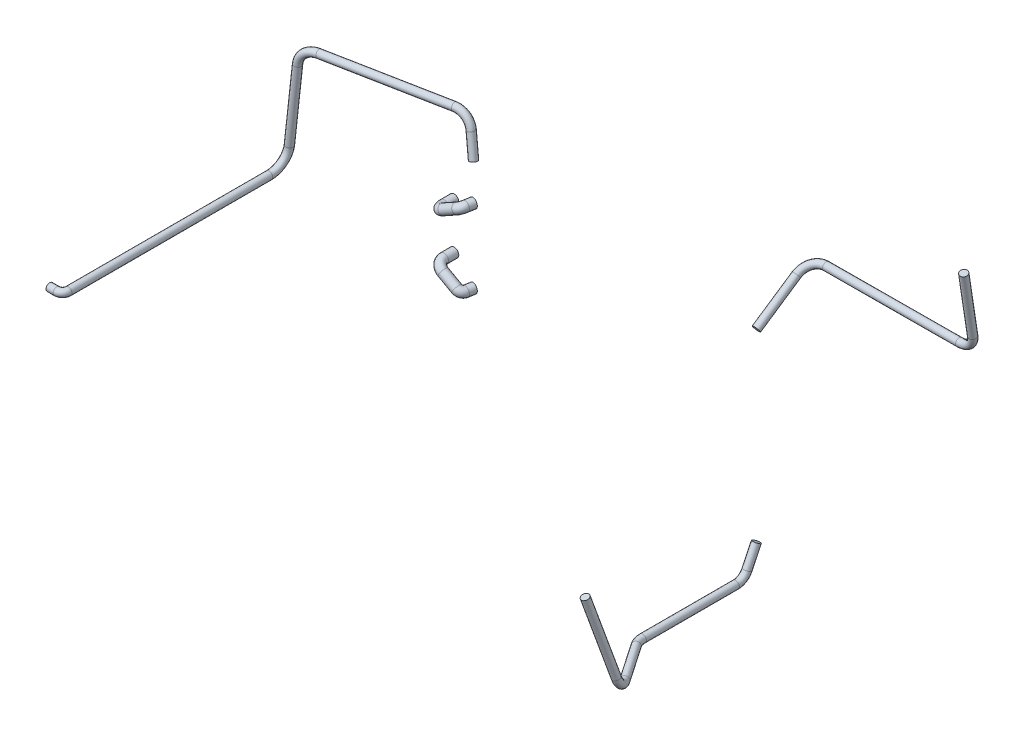
ISO-10303-21;
HEADER;
FILE_DESCRIPTION(('STEP AP214'),'2;1');
FILE_NAME('part.step','',(''),(''),'','','');
FILE_SCHEMA(('AUTOMOTIVE_DESIGN { 1 0 10303 214 1 1 1 1 }'));
ENDSEC;
DATA;
#1=APPLICATION_CONTEXT('core data for automotive mechanical design processes');
#2=APPLICATION_PROTOCOL_DEFINITION('international standard','automotive_design',2000,#1);
#3=PRODUCT_CONTEXT('',#1,'mechanical');
#4=PRODUCT('Part','Part','',(#3));
#5=PRODUCT_RELATED_PRODUCT_CATEGORY('part','',(#4));
#6=PRODUCT_DEFINITION_FORMATION('','',#4);
#7=PRODUCT_DEFINITION_CONTEXT('part definition',#1,'design');
#8=PRODUCT_DEFINITION('design','',#6,#7);
#9=PRODUCT_DEFINITION_SHAPE('','',#8);
#10=(LENGTH_UNIT() NAMED_UNIT(*) SI_UNIT(.MILLI.,.METRE.));
#11=(NAMED_UNIT(*) PLANE_ANGLE_UNIT() SI_UNIT($,.RADIAN.));
#12=(NAMED_UNIT(*) SI_UNIT($,.STERADIAN.) SOLID_ANGLE_UNIT());
#13=UNCERTAINTY_MEASURE_WITH_UNIT(LENGTH_MEASURE(1.E-05),#10,'distance_accuracy_value','');
#14=(GEOMETRIC_REPRESENTATION_CONTEXT(3) GLOBAL_UNCERTAINTY_ASSIGNED_CONTEXT((#13)) GLOBAL_UNIT_ASSIGNED_CONTEXT((#10,
#11,#12)) REPRESENTATION_CONTEXT('',''));
#15=CARTESIAN_POINT('',(0.,0.,0.));
#16=DIRECTION('',(0.,0.,1.));
#17=DIRECTION('',(1.,0.,0.));
#18=AXIS2_PLACEMENT_3D('',#15,#16,#17);
#19=CARTESIAN_POINT('',(846.,225.,330.));
#20=DIRECTION('',(0.0688927399967362,0.975980483287148,0.206678219990223));
#21=DIRECTION('',(-0.916848233170523,-0.0197221567225729,0.398748484468969));
#22=AXIS2_PLACEMENT_3D('',#19,#20,#21);
#23=PLANE('',#22);
#24=CARTESIAN_POINT('',(846.,225.,330.));
#25=DIRECTION('',(0.0688927399967362,0.975980483287148,0.206678219990223));
#26=DIRECTION('',(-0.916848233170523,-0.0197221567225729,0.398748484468969));
#27=AXIS2_PLACEMENT_3D('',#24,#25,#26);
#28=CIRCLE('',#27,4.);
#29=CARTESIAN_POINT('',(842.332607067318,224.92111137311,331.594993937876));
#30=VERTEX_POINT('',#29);
#31=EDGE_CURVE('E128',#30,#30,#28,.T.);
#32=ORIENTED_EDGE('',*,*,#31,.T.);
#33=EDGE_LOOP('',(#32));
#34=FACE_BOUND('',#33,.T.);
#35=ADVANCED_FACE('F107',(#34),#23,.T.);
#36=CARTESIAN_POINT('',(661.,100.,370.));
#37=DIRECTION('',(0.0143591631723555,0.574366526894194,-0.818472300824219));
#38=DIRECTION('',(0.,0.81855669246241,0.574425749096433));
#39=AXIS2_PLACEMENT_3D('',#36,#37,#38);
#40=PLANE('',#39);
#41=CARTESIAN_POINT('',(661.,100.,370.));
#42=DIRECTION('',(0.0143591631723555,0.574366526894194,-0.818472300824219));
#43=DIRECTION('',(0.,0.81855669246241,0.574425749096433));
#44=AXIS2_PLACEMENT_3D('',#41,#42,#43);
#45=CIRCLE('',#44,4.);
#46=CARTESIAN_POINT('',(661.,103.27422676985,372.297702996386));
#47=VERTEX_POINT('',#46);
#48=EDGE_CURVE('E12',#47,#47,#45,.T.);
#49=ORIENTED_EDGE('',*,*,#48,.F.);
#50=EDGE_LOOP('',(#49));
#51=FACE_BOUND('',#50,.T.);
#52=ADVANCED_FACE('F139',(#51),#40,.F.);
#53=CARTESIAN_POINT('',(846.,225.,330.));
#54=DIRECTION('',(-0.0688927399967393,-0.975980483287148,-0.20667821999022));
#55=DIRECTION('',(0.,0.207170441904584,-0.97830486454942));
#56=AXIS2_PLACEMENT_3D('',#53,#54,#55);
#57=CYLINDRICAL_SURFACE('',#56,4.);
#58=CARTESIAN_POINT('',(841.158739606136,156.415477753594,315.476218818408));
#59=DIRECTION('',(0.0688927399967362,0.975980483287148,0.206678219990223));
#60=DIRECTION('',(-0.916848233170523,-0.0197221567225729,0.398748484468969));
#61=AXIS2_PLACEMENT_3D('',#58,#59,#60);
#62=CIRCLE('',#61,4.);
#63=CARTESIAN_POINT('',(845.149175349941,156.150454357678,315.397572940079));
#64=VERTEX_POINT('',#63);
#65=EDGE_CURVE('E130',#64,#64,#62,.T.);
#66=ORIENTED_EDGE('',*,*,#65,.T.);
#67=EDGE_LOOP('',(#66));
#68=FACE_BOUND('',#67,.T.);
#69=ORIENTED_EDGE('',*,*,#31,.F.);
#70=EDGE_LOOP('',(#69));
#71=FACE_BOUND('',#70,.T.);
#72=ADVANCED_FACE('F134',(#68,#71),#57,.T.);
#73=CARTESIAN_POINT('',(823.201778759012,157.608083035219,315.830125270888));
#74=DIRECTION('',(-0.00549556965403732,0.207538571640638,-0.978211398418328));
#75=DIRECTION('',(0.,0.978226170373947,0.207541705677488));
#76=AXIS2_PLACEMENT_3D('',#73,#74,#75);
#77=TOROIDAL_SURFACE('',#76,18.,4.);
#78=CARTESIAN_POINT('',(823.180792043627,140.,312.094489932339));
#79=DIRECTION('',(0.999984219537789,0.,-0.00561788887380599));
#80=DIRECTION('',(0.00321244852110147,0.820375724292605,0.571815836756803));
#81=AXIS2_PLACEMENT_3D('',#78,#79,#80);
#82=CIRCLE('',#81,4.);
#83=CARTESIAN_POINT('',(823.176128329097,136.08709265884,311.264348745995));
#84=VERTEX_POINT('',#83);
#85=EDGE_CURVE('E122',#84,#84,#82,.T.);
#86=CARTESIAN_POINT('',(823.201778759012,157.608083035219,315.830125270888));
#87=DIRECTION('',(-0.00549556965403732,0.207538571640638,-0.978211398418328));
#88=DIRECTION('',(0.,0.978226170373947,0.207541705677488));
#89=AXIS2_PLACEMENT_3D('',#86,#87,#88);
#90=CIRCLE('',#89,22.);
#91=EDGE_CURVE('',#64,#84,#90,.T.);
#92=ORIENTED_EDGE('',*,*,#65,.F.);
#93=ORIENTED_EDGE('',*,*,#85,.T.);
#94=ORIENTED_EDGE('',*,*,#91,.T.);
#95=ORIENTED_EDGE('',*,*,#91,.F.);
#96=EDGE_LOOP('',(#92,#94,#93,#95));
#97=FACE_BOUND('',#96,.T.);
#98=ADVANCED_FACE('F137',(#97),#77,.T.);
#99=CARTESIAN_POINT('',(823.180792043627,140.,312.094489932339));
#100=DIRECTION('',(-0.999984219537789,0.,0.00561788887380822));
#101=DIRECTION('',(0.00561788887380822,0.,0.999984219537789));
#102=AXIS2_PLACEMENT_3D('',#99,#100,#101);
#103=CYLINDRICAL_SURFACE('',#102,4.);
#104=CARTESIAN_POINT('',(679.661668733026,140.,312.90077714195));
#105=DIRECTION('',(0.999984219537789,0.,-0.00561788887380499));
#106=DIRECTION('',(0.00321244852110208,0.820375724292605,0.571815836756803));
#107=AXIS2_PLACEMENT_3D('',#104,#105,#106);
#108=CIRCLE('',#107,4.);
#109=CARTESIAN_POINT('',(679.643275184946,142.297879037605,309.626725583723));
#110=VERTEX_POINT('',#109);
#111=EDGE_CURVE('E117',#110,#110,#108,.T.);
#112=ORIENTED_EDGE('',*,*,#111,.T.);
#113=EDGE_LOOP('',(#112));
#114=FACE_BOUND('',#113,.T.);
#115=ORIENTED_EDGE('',*,*,#85,.F.);
#116=EDGE_LOOP('',(#115));
#117=FACE_BOUND('',#116,.T.);
#118=ADVANCED_FACE('F144',(#114,#117),#103,.T.);
#119=CARTESIAN_POINT('',(679.744439699385,129.65954433078,327.63400915397));
#120=DIRECTION('',(0.00322730726967955,0.818525806272238,0.574460694002793));
#121=DIRECTION('',(0.,-0.57446368567735,0.818530068988303));
#122=AXIS2_PLACEMENT_3D('',#119,#120,#121);
#123=TOROIDAL_SURFACE('',#122,18.,4.);
#124=CARTESIAN_POINT('',(661.746389214672,129.855568586841,327.455814763752));
#125=DIRECTION('',(0.0143591631723555,0.574366526894194,-0.818472300824219));
#126=DIRECTION('',(0.,0.81855669246241,0.574425749096433));
#127=AXIS2_PLACEMENT_3D('',#124,#125,#126);
#128=CIRCLE('',#127,4.);
#129=CARTESIAN_POINT('',(657.74682244029,129.899129532632,327.41621601037));
#130=VERTEX_POINT('',#129);
#131=EDGE_CURVE('E111',#130,#130,#128,.T.);
#132=CARTESIAN_POINT('',(679.744439699385,129.65954433078,327.63400915397));
#133=DIRECTION('',(0.00322730726967955,0.818525806272238,0.574460694002793));
#134=DIRECTION('',(0.,-0.57446368567735,0.818530068988303));
#135=AXIS2_PLACEMENT_3D('',#132,#133,#134);
#136=CIRCLE('',#135,22.);
#137=EDGE_CURVE('',#110,#130,#136,.T.);
#138=ORIENTED_EDGE('',*,*,#111,.F.);
#139=ORIENTED_EDGE('',*,*,#131,.T.);
#140=ORIENTED_EDGE('',*,*,#137,.T.);
#141=ORIENTED_EDGE('',*,*,#137,.F.);
#142=EDGE_LOOP('',(#138,#140,#139,#141));
#143=FACE_BOUND('',#142,.T.);
#144=ADVANCED_FACE('F151',(#143),#123,.T.);
#145=CARTESIAN_POINT('',(661.746389214671,129.85556858684,327.455814763753));
#146=DIRECTION('',(-0.0143591631723542,-0.574366526894191,0.818472300824221));
#147=DIRECTION('',(0.,-0.818556692462413,-0.57442574909643));
#148=AXIS2_PLACEMENT_3D('',#145,#146,#147);
#149=CYLINDRICAL_SURFACE('',#148,4.);
#150=ORIENTED_EDGE('',*,*,#48,.T.);
#151=EDGE_LOOP('',(#150));
#152=FACE_BOUND('',#151,.T.);
#153=ORIENTED_EDGE('',*,*,#131,.F.);
#154=EDGE_LOOP('',(#153));
#155=FACE_BOUND('',#154,.T.);
#156=ADVANCED_FACE('F149',(#152,#155),#149,.T.);
#157=CLOSED_SHELL('',(#35,#52,#72,#98,#118,#144,#156));
#158=MANIFOLD_SOLID_BREP('B2',#157);
#159=CARTESIAN_POINT('',(690.,-29.9999999999998,584.864900164287));
#160=DIRECTION('',(-0.0972724077693302,0.953269596139435,0.286033487135536));
#161=DIRECTION('',(0.395013736834047,-0.226812428138079,0.890236075518461));
#162=AXIS2_PLACEMENT_3D('',#159,#160,#161);
#163=PLANE('',#162);
#164=CARTESIAN_POINT('',(690.,-29.9999999999998,584.864900164287));
#165=DIRECTION('',(-0.0972724077693302,0.953269596139435,0.286033487135536));
#166=DIRECTION('',(0.395013736834047,-0.226812428138079,0.890236075518461));
#167=AXIS2_PLACEMENT_3D('',#164,#165,#166);
#168=CIRCLE('',#167,4.00000000000001);
#169=CARTESIAN_POINT('',(691.580054947336,-30.9072497125521,588.425844466361));
#170=VERTEX_POINT('',#169);
#171=EDGE_CURVE('E244',#170,#170,#168,.T.);
#172=ORIENTED_EDGE('',*,*,#171,.T.);
#173=EDGE_LOOP('',(#172));
#174=FACE_BOUND('',#173,.T.);
#175=ADVANCED_FACE('F220',(#174),#163,.T.);
#176=CARTESIAN_POINT('',(661.,-100.,370.));
#177=DIRECTION('',(0.0314658387763716,-0.881043485738572,0.471987581645668));
#178=DIRECTION('',(0.,-0.472221412515422,-0.88147997002878));
#179=AXIS2_PLACEMENT_3D('',#176,#177,#178);
#180=PLANE('',#179);
#181=CARTESIAN_POINT('',(661.,-100.,370.));
#182=DIRECTION('',(0.0314658387763716,-0.881043485738572,0.471987581645668));
#183=DIRECTION('',(0.,-0.472221412515422,-0.88147997002878));
#184=AXIS2_PLACEMENT_3D('',#181,#182,#183);
#185=CIRCLE('',#184,4.00000000000001);
#186=CARTESIAN_POINT('',(661.,-101.888885650062,366.474080119885));
#187=VERTEX_POINT('',#186);
#188=EDGE_CURVE('E110',#187,#187,#185,.T.);
#189=ORIENTED_EDGE('',*,*,#188,.F.);
#190=EDGE_LOOP('',(#189));
#191=FACE_BOUND('',#190,.T.);
#192=ADVANCED_FACE('F251',(#191),#180,.F.);
#193=CARTESIAN_POINT('',(690.,-29.9999999999998,584.864900164287));
#194=DIRECTION('',(0.0972724077693298,-0.953269596139435,-0.286033487135537));
#195=DIRECTION('',(0.,0.287396379658363,-0.957811735655429));
#196=AXIS2_PLACEMENT_3D('',#193,#194,#195);
#197=CYLINDRICAL_SURFACE('',#196,4.00000000000001);
#198=CARTESIAN_POINT('',(698.541892534363,-113.71054683676,559.747116361352));
#199=DIRECTION('',(-0.0972724077693302,0.953269596139435,0.286033487135536));
#200=DIRECTION('',(0.395013736834047,-0.226812428138079,0.890236075518461));
#201=AXIS2_PLACEMENT_3D('',#198,#199,#200);
#202=CIRCLE('',#201,4.00000000000001);
#203=CARTESIAN_POINT('',(700.912376635838,-114.412212403913,562.891710223289));
#204=VERTEX_POINT('',#203);
#205=EDGE_CURVE('E245',#204,#204,#202,.T.);
#206=ORIENTED_EDGE('',*,*,#205,.T.);
#207=EDGE_LOOP('',(#206));
#208=FACE_BOUND('',#207,.T.);
#209=ORIENTED_EDGE('',*,*,#171,.F.);
#210=EDGE_LOOP('',(#209));
#211=FACE_BOUND('',#210,.T.);
#212=ADVANCED_FACE('F250',(#208,#211),#197,.T.);
#213=CARTESIAN_POINT('',(687.874714077729,-110.553051784569,545.596443982638));
#214=DIRECTION('',(0.799586392441657,0.245980012537813,-0.54786443072537));
#215=DIRECTION('',(-0.565231215871582,0.,-0.824932526091882));
#216=AXIS2_PLACEMENT_3D('',#213,#214,#215);
#217=TOROIDAL_SURFACE('',#216,17.9999999999999,4.00000000000001);
#218=CARTESIAN_POINT('',(691.527218513726,-128.,543.093803514435));
#219=DIRECTION('',(0.565231215871581,0.,0.824932526091882));
#220=DIRECTION('',(0.0155441165112846,-0.99982245690374,-0.0106505921362335));
#221=AXIS2_PLACEMENT_3D('',#218,#219,#220);
#222=CIRCLE('',#221,4.00000000000001);
#223=CARTESIAN_POINT('',(692.33888616617,-131.877099603429,542.537661188167));
#224=VERTEX_POINT('',#223);
#225=EDGE_CURVE('E239',#224,#224,#222,.T.);
#226=CARTESIAN_POINT('',(687.874714077729,-110.553051784569,545.596443982638));
#227=DIRECTION('',(0.799586392441657,0.245980012537813,-0.54786443072537));
#228=DIRECTION('',(-0.565231215871582,0.,-0.824932526091882));
#229=AXIS2_PLACEMENT_3D('',#226,#227,#228);
#230=CIRCLE('',#229,21.9999999999999);
#231=EDGE_CURVE('',#204,#224,#230,.T.);
#232=ORIENTED_EDGE('',*,*,#205,.F.);
#233=ORIENTED_EDGE('',*,*,#225,.T.);
#234=ORIENTED_EDGE('',*,*,#231,.T.);
#235=ORIENTED_EDGE('',*,*,#231,.F.);
#236=EDGE_LOOP('',(#232,#234,#233,#235));
#237=FACE_BOUND('',#236,.T.);
#238=ADVANCED_FACE('F252',(#237),#217,.T.);
#239=CARTESIAN_POINT('',(691.527218513726,-128.,543.093803514435));
#240=DIRECTION('',(-0.565231215871581,0.,-0.824932526091882));
#241=DIRECTION('',(-0.824932526091882,0.,0.565231215871581));
#242=AXIS2_PLACEMENT_3D('',#239,#240,#241);
#243=CYLINDRICAL_SURFACE('',#242,4.00000000000001);
#244=CARTESIAN_POINT('',(665.151214530346,-128.,504.599072538426));
#245=DIRECTION('',(0.565231215871582,0.,0.824932526091882));
#246=DIRECTION('',(0.0155441165112823,-0.99982245690374,-0.0106505921362371));
#247=AXIS2_PLACEMENT_3D('',#244,#245,#246);
#248=CIRCLE('',#247,4.00000000000001);
#249=CARTESIAN_POINT('',(661.851484425979,-128.,506.859997401912));
#250=VERTEX_POINT('',#249);
#251=EDGE_CURVE('E237',#250,#250,#248,.T.);
#252=ORIENTED_EDGE('',*,*,#251,.T.);
#253=EDGE_LOOP('',(#252));
#254=FACE_BOUND('',#253,.T.);
#255=ORIENTED_EDGE('',*,*,#225,.F.);
#256=EDGE_LOOP('',(#255));
#257=FACE_BOUND('',#256,.T.);
#258=ADVANCED_FACE('F257',(#254,#257),#243,.T.);
#259=CARTESIAN_POINT('',(680.,-128.,494.424910652737));
#260=DIRECTION('',(0.,-1.,0.));
#261=DIRECTION('',(0.,0.,-1.));
#262=AXIS2_PLACEMENT_3D('',#259,#260,#261);
#263=TOROIDAL_SURFACE('',#262,17.9999999999998,4.00000000000001);
#264=CARTESIAN_POINT('',(662.,-128.,494.424910652737));
#265=DIRECTION('',(0.,0.,1.));
#266=DIRECTION('',(0.0188428944424364,-0.99982245690374,0.));
#267=AXIS2_PLACEMENT_3D('',#264,#265,#266);
#268=CIRCLE('',#267,4.00000000000001);
#269=CARTESIAN_POINT('',(658.,-128.,494.424910652737));
#270=VERTEX_POINT('',#269);
#271=EDGE_CURVE('E231',#270,#270,#268,.T.);
#272=CARTESIAN_POINT('',(680.,-128.,494.424910652737));
#273=DIRECTION('',(0.,-1.,0.));
#274=DIRECTION('',(0.,0.,-1.));
#275=AXIS2_PLACEMENT_3D('',#272,#273,#274);
#276=CIRCLE('',#275,21.9999999999998);
#277=EDGE_CURVE('',#250,#270,#276,.T.);
#278=ORIENTED_EDGE('',*,*,#251,.F.);
#279=ORIENTED_EDGE('',*,*,#271,.T.);
#280=ORIENTED_EDGE('',*,*,#277,.T.);
#281=ORIENTED_EDGE('',*,*,#277,.F.);
#282=EDGE_LOOP('',(#278,#280,#279,#281));
#283=FACE_BOUND('',#282,.T.);
#284=ADVANCED_FACE('F280',(#283),#263,.T.);
#285=CARTESIAN_POINT('',(662.,-128.,494.424910652737));
#286=DIRECTION('',(0.,0.,-1.));
#287=DIRECTION('',(-1.,0.,0.));
#288=AXIS2_PLACEMENT_3D('',#285,#286,#287);
#289=CYLINDRICAL_SURFACE('',#288,4.00000000000001);
#290=CARTESIAN_POINT('',(662.,-128.,393.565312174315));
#291=DIRECTION('',(0.,0.,1.));
#292=DIRECTION('',(0.0188428944424364,-0.99982245690374,0.));
#293=AXIS2_PLACEMENT_3D('',#290,#291,#292);
#294=CIRCLE('',#293,4.00000000000001);
#295=CARTESIAN_POINT('',(662.14276612205,-131.99745141739,393.565312174315));
#296=VERTEX_POINT('',#295);
#297=EDGE_CURVE('E230',#296,#296,#294,.T.);
#298=ORIENTED_EDGE('',*,*,#297,.T.);
#299=EDGE_LOOP('',(#298));
#300=FACE_BOUND('',#299,.T.);
#301=ORIENTED_EDGE('',*,*,#271,.F.);
#302=EDGE_LOOP('',(#301));
#303=FACE_BOUND('',#302,.T.);
#304=ADVANCED_FACE('F271',(#300,#303),#289,.T.);
#305=CARTESIAN_POINT('',(661.489567437095,-113.707888238657,393.565312174315));
#306=DIRECTION('',(0.99936285434755,0.0356915305124057,0.));
#307=DIRECTION('',(-0.0356915305124057,0.99936285434755,0.));
#308=AXIS2_PLACEMENT_3D('',#305,#306,#307);
#309=TOROIDAL_SURFACE('',#308,14.3012237238635,4.00000000000001);
#310=CARTESIAN_POINT('',(661.730485268054,-120.453587505501,380.957279020806));
#311=DIRECTION('',(0.0314658387763716,-0.881043485738572,0.471987581645668));
#312=DIRECTION('',(0.,-0.472221412515422,-0.88147997002878));
#313=AXIS2_PLACEMENT_3D('',#310,#311,#312);
#314=CIRCLE('',#313,4.00000000000001);
#315=CARTESIAN_POINT('',(661.797869104741,-122.340334932741,377.430858234177));
#316=VERTEX_POINT('',#315);
#317=EDGE_CURVE('E224',#316,#316,#314,.T.);
#318=CARTESIAN_POINT('',(661.489567437095,-113.707888238657,393.565312174315));
#319=DIRECTION('',(0.99936285434755,0.0356915305124057,0.));
#320=DIRECTION('',(-0.0356915305124057,0.99936285434755,0.));
#321=AXIS2_PLACEMENT_3D('',#318,#319,#320);
#322=CIRCLE('',#321,18.3012237238635);
#323=EDGE_CURVE('',#296,#316,#322,.T.);
#324=ORIENTED_EDGE('',*,*,#297,.F.);
#325=ORIENTED_EDGE('',*,*,#317,.T.);
#326=ORIENTED_EDGE('',*,*,#323,.T.);
#327=ORIENTED_EDGE('',*,*,#323,.F.);
#328=EDGE_LOOP('',(#324,#326,#325,#327));
#329=FACE_BOUND('',#328,.T.);
#330=ADVANCED_FACE('F266',(#329),#309,.T.);
#331=CARTESIAN_POINT('',(661.730485268054,-120.453587505503,380.957279020805));
#332=DIRECTION('',(-0.0314658387763716,0.881043485738573,-0.471987581645667));
#333=DIRECTION('',(0.,0.472221412515421,0.881479970028781));
#334=AXIS2_PLACEMENT_3D('',#331,#332,#333);
#335=CYLINDRICAL_SURFACE('',#334,4.00000000000001);
#336=ORIENTED_EDGE('',*,*,#188,.T.);
#337=EDGE_LOOP('',(#336));
#338=FACE_BOUND('',#337,.T.);
#339=ORIENTED_EDGE('',*,*,#317,.F.);
#340=EDGE_LOOP('',(#339));
#341=FACE_BOUND('',#340,.T.);
#342=ADVANCED_FACE('F262',(#338,#341),#335,.T.);
#343=CLOSED_SHELL('',(#175,#192,#212,#238,#258,#284,#304,#330,#342));
#344=MANIFOLD_SOLID_BREP('B7',#343);
#345=CARTESIAN_POINT('',(138.,0.,614.));
#346=DIRECTION('',(-1.,0.,0.));
#347=DIRECTION('',(0.,-0.326144478322474,0.945319934868488));
#348=AXIS2_PLACEMENT_3D('',#345,#346,#347);
#349=PLANE('',#348);
#350=CARTESIAN_POINT('',(138.,0.,614.));
#351=DIRECTION('',(-1.,0.,0.));
#352=DIRECTION('',(0.,-0.326144478322474,0.945319934868488));
#353=AXIS2_PLACEMENT_3D('',#350,#351,#352);
#354=CIRCLE('',#353,4.00000000000002);
#355=CARTESIAN_POINT('',(138.,-1.3045779132899,617.781279739474));
#356=VERTEX_POINT('',#355);
#357=EDGE_CURVE('E388',#356,#356,#354,.T.);
#358=ORIENTED_EDGE('',*,*,#357,.T.);
#359=EDGE_LOOP('',(#358));
#360=FACE_BOUND('',#359,.T.);
#361=ADVANCED_FACE('F356',(#360),#349,.T.);
#362=CARTESIAN_POINT('',(329.,80.,345.));
#363=DIRECTION('',(-0.22860022860034,0.965200965201449,-0.127000127000185));
#364=DIRECTION('',(-0.97308028749001,-0.23046638387921,0.));
#365=AXIS2_PLACEMENT_3D('',#362,#363,#364);
#366=PLANE('',#365);
#367=CARTESIAN_POINT('',(329.,80.,345.));
#368=DIRECTION('',(-0.22860022860034,0.965200965201449,-0.127000127000185));
#369=DIRECTION('',(-0.97308028749001,-0.23046638387921,0.));
#370=AXIS2_PLACEMENT_3D('',#367,#368,#369);
#371=CIRCLE('',#370,4.00000000000002);
#372=CARTESIAN_POINT('',(325.10767885004,79.0781344644832,345.));
#373=VERTEX_POINT('',#372);
#374=EDGE_CURVE('E216',#373,#373,#371,.T.);
#375=ORIENTED_EDGE('',*,*,#374,.F.);
#376=EDGE_LOOP('',(#375));
#377=FACE_BOUND('',#376,.T.);
#378=ADVANCED_FACE('F399',(#377),#366,.F.);
#379=CARTESIAN_POINT('',(138.,0.,614.));
#380=DIRECTION('',(1.,0.,0.));
#381=DIRECTION('',(0.,0.,-1.));
#382=AXIS2_PLACEMENT_3D('',#379,#380,#381);
#383=CYLINDRICAL_SURFACE('',#382,4.00000000000002);
#384=CARTESIAN_POINT('',(145.7,0.,614.));
#385=DIRECTION('',(-1.,0.,0.));
#386=DIRECTION('',(0.,-0.326144478322474,0.945319934868488));
#387=AXIS2_PLACEMENT_3D('',#384,#385,#386);
#388=CIRCLE('',#387,4.00000000000002);
#389=CARTESIAN_POINT('',(145.7,0.,618.));
#390=VERTEX_POINT('',#389);
#391=EDGE_CURVE('E390',#390,#390,#388,.T.);
#392=ORIENTED_EDGE('',*,*,#391,.T.);
#393=EDGE_LOOP('',(#392));
#394=FACE_BOUND('',#393,.T.);
#395=ORIENTED_EDGE('',*,*,#357,.F.);
#396=EDGE_LOOP('',(#395));
#397=FACE_BOUND('',#396,.T.);
#398=ADVANCED_FACE('F394',(#394,#397),#383,.T.);
#399=CARTESIAN_POINT('',(145.7,0.,607.7));
#400=DIRECTION('',(0.,1.,0.));
#401=DIRECTION('',(0.,0.,1.));
#402=AXIS2_PLACEMENT_3D('',#399,#400,#401);
#403=TOROIDAL_SURFACE('',#402,6.29999999999986,4.00000000000002);
#404=CARTESIAN_POINT('',(152.,0.,607.7));
#405=DIRECTION('',(0.,0.,1.));
#406=DIRECTION('',(0.945319934868488,-0.326144478322474,0.));
#407=AXIS2_PLACEMENT_3D('',#404,#405,#406);
#408=CIRCLE('',#407,4.00000000000002);
#409=CARTESIAN_POINT('',(156.,0.,607.7));
#410=VERTEX_POINT('',#409);
#411=EDGE_CURVE('E383',#410,#410,#408,.T.);
#412=CARTESIAN_POINT('',(145.7,0.,607.7));
#413=DIRECTION('',(0.,1.,0.));
#414=DIRECTION('',(0.,0.,1.));
#415=AXIS2_PLACEMENT_3D('',#412,#413,#414);
#416=CIRCLE('',#415,10.2999999999999);
#417=EDGE_CURVE('',#390,#410,#416,.T.);
#418=ORIENTED_EDGE('',*,*,#391,.F.);
#419=ORIENTED_EDGE('',*,*,#411,.T.);
#420=ORIENTED_EDGE('',*,*,#417,.T.);
#421=ORIENTED_EDGE('',*,*,#417,.F.);
#422=EDGE_LOOP('',(#418,#420,#419,#421));
#423=FACE_BOUND('',#422,.T.);
#424=ADVANCED_FACE('F397',(#423),#403,.T.);
#425=CARTESIAN_POINT('',(152.,0.,607.7));
#426=DIRECTION('',(0.,0.,-1.));
#427=DIRECTION('',(-1.,0.,0.));
#428=AXIS2_PLACEMENT_3D('',#425,#426,#427);
#429=CYLINDRICAL_SURFACE('',#428,4.00000000000002);
#430=CARTESIAN_POINT('',(152.,0.,390.));
#431=DIRECTION('',(0.,0.,1.));
#432=DIRECTION('',(0.945319934868488,-0.326144478322474,0.));
#433=AXIS2_PLACEMENT_3D('',#430,#431,#432);
#434=CIRCLE('',#433,4.00000000000002);
#435=CARTESIAN_POINT('',(151.561972257256,-3.97594412644186,390.));
#436=VERTEX_POINT('',#435);
#437=EDGE_CURVE('E381',#436,#436,#434,.T.);
#438=ORIENTED_EDGE('',*,*,#437,.T.);
#439=EDGE_LOOP('',(#438));
#440=FACE_BOUND('',#439,.T.);
#441=ORIENTED_EDGE('',*,*,#411,.F.);
#442=EDGE_LOOP('',(#441));
#443=FACE_BOUND('',#442,.T.);
#444=ADVANCED_FACE('F403',(#440,#443),#429,.T.);
#445=CARTESIAN_POINT('',(154.190138713718,19.879720632209,390.));
#446=DIRECTION('',(0.993986031610447,-0.109506935685896,0.));
#447=DIRECTION('',(0.109506935685896,0.993986031610447,0.));
#448=AXIS2_PLACEMENT_3D('',#445,#446,#447);
#449=TOROIDAL_SURFACE('',#448,20.0000000000001,4.00000000000002);
#450=CARTESIAN_POINT('',(154.190138713718,19.8797206322089,370.));
#451=DIRECTION('',(-0.109506935685898,-0.993986031610447,0.));
#452=DIRECTION('',(0.969484169648442,-0.106807578012118,-0.220663966429177));
#453=AXIS2_PLACEMENT_3D('',#450,#451,#452);
#454=CIRCLE('',#453,4.00000000000002);
#455=CARTESIAN_POINT('',(154.190138713718,19.8797206322089,366.));
#456=VERTEX_POINT('',#455);
#457=EDGE_CURVE('E378',#456,#456,#454,.T.);
#458=CARTESIAN_POINT('',(154.190138713718,19.879720632209,390.));
#459=DIRECTION('',(0.993986031610447,-0.109506935685896,0.));
#460=DIRECTION('',(0.109506935685896,0.993986031610447,0.));
#461=AXIS2_PLACEMENT_3D('',#458,#459,#460);
#462=CIRCLE('',#461,24.0000000000001);
#463=EDGE_CURVE('',#436,#456,#462,.T.);
#464=ORIENTED_EDGE('',*,*,#437,.F.);
#465=ORIENTED_EDGE('',*,*,#457,.T.);
#466=ORIENTED_EDGE('',*,*,#463,.T.);
#467=ORIENTED_EDGE('',*,*,#463,.F.);
#468=EDGE_LOOP('',(#464,#466,#465,#467));
#469=FACE_BOUND('',#468,.T.);
#470=ADVANCED_FACE('F429',(#469),#449,.T.);
#471=CARTESIAN_POINT('',(154.190138713718,19.8797206322089,370.));
#472=DIRECTION('',(0.109506935685896,0.993986031610447,0.));
#473=DIRECTION('',(-0.993986031610447,0.109506935685896,0.));
#474=AXIS2_PLACEMENT_3D('',#471,#472,#473);
#475=CYLINDRICAL_SURFACE('',#474,4.00000000000002);
#476=CARTESIAN_POINT('',(163.033931138136,100.154144176924,370.));
#477=DIRECTION('',(-0.109506935685898,-0.993986031610447,0.));
#478=DIRECTION('',(0.969484169648442,-0.106807578012118,-0.220663966429177));
#479=AXIS2_PLACEMENT_3D('',#476,#477,#478);
#480=CIRCLE('',#479,4.00000000000002);
#481=CARTESIAN_POINT('',(159.131284397477,100.584096783945,370.764518916275));
#482=VERTEX_POINT('',#481);
#483=EDGE_CURVE('E374',#482,#482,#480,.T.);
#484=ORIENTED_EDGE('',*,*,#483,.T.);
#485=EDGE_LOOP('',(#484));
#486=FACE_BOUND('',#485,.T.);
#487=ORIENTED_EDGE('',*,*,#457,.F.);
#488=EDGE_LOOP('',(#487));
#489=FACE_BOUND('',#488,.T.);
#490=ADVANCED_FACE('F426',(#486,#489),#475,.T.);
#491=CARTESIAN_POINT('',(182.547164841429,98.0043811418153,366.177405418625));
#492=DIRECTION('',(-0.189980280919827,0.0209300309487931,-0.981564784752441));
#493=DIRECTION('',(-0.981779850590281,0.,0.19002190656586));
#494=AXIS2_PLACEMENT_3D('',#491,#492,#493);
#495=TOROIDAL_SURFACE('',#494,20.0000000000002,4.00000000000002);
#496=CARTESIAN_POINT('',(182.626708129136,118.,366.58837907178));
#497=DIRECTION('',(-0.981779850590282,0.,0.190021906565861));
#498=DIRECTION('',(-0.009708505319868,-0.998693976174228,-0.050160610819302));
#499=AXIS2_PLACEMENT_3D('',#496,#497,#498);
#500=CIRCLE('',#499,4.00000000000002);
#501=CARTESIAN_POINT('',(182.642616786677,121.999123771637,366.670573802411));
#502=VERTEX_POINT('',#501);
#503=EDGE_CURVE('E367',#502,#502,#500,.T.);
#504=CARTESIAN_POINT('',(182.547164841429,98.0043811418153,366.177405418625));
#505=DIRECTION('',(-0.189980280919827,0.0209300309487931,-0.981564784752441));
#506=DIRECTION('',(-0.981779850590281,0.,0.19002190656586));
#507=AXIS2_PLACEMENT_3D('',#504,#505,#506);
#508=CIRCLE('',#507,24.0000000000002);
#509=EDGE_CURVE('',#482,#502,#508,.T.);
#510=ORIENTED_EDGE('',*,*,#483,.F.);
#511=ORIENTED_EDGE('',*,*,#503,.T.);
#512=ORIENTED_EDGE('',*,*,#509,.T.);
#513=ORIENTED_EDGE('',*,*,#509,.F.);
#514=EDGE_LOOP('',(#510,#512,#511,#513));
#515=FACE_BOUND('',#514,.T.);
#516=ADVANCED_FACE('F425',(#515),#495,.T.);
#517=CARTESIAN_POINT('',(182.626708129136,118.,366.58837907178));
#518=DIRECTION('',(0.981779850590281,0.,-0.190021906565861));
#519=DIRECTION('',(-0.190021906565861,0.,-0.981779850590282));
#520=AXIS2_PLACEMENT_3D('',#517,#518,#519);
#521=CYLINDRICAL_SURFACE('',#520,4.00000000000002);
#522=CARTESIAN_POINT('',(305.802558577869,118.,342.747891888154));
#523=DIRECTION('',(-0.981779850590281,0.,0.190021906565861));
#524=DIRECTION('',(-0.00970850531986742,-0.998693976174228,-0.0501606108193021));
#525=AXIS2_PLACEMENT_3D('',#522,#523,#524);
#526=CIRCLE('',#525,4.00000000000002);
#527=CARTESIAN_POINT('',(305.672125339471,121.940664808584,342.073986823096));
#528=VERTEX_POINT('',#527);
#529=EDGE_CURVE('E368',#528,#528,#526,.T.);
#530=ORIENTED_EDGE('',*,*,#529,.T.);
#531=EDGE_LOOP('',(#530));
#532=FACE_BOUND('',#531,.T.);
#533=ORIENTED_EDGE('',*,*,#503,.F.);
#534=EDGE_LOOP('',(#533));
#535=FACE_BOUND('',#534,.T.);
#536=ADVANCED_FACE('F418',(#532,#535),#521,.T.);
#537=CARTESIAN_POINT('',(306.380264272596,100.546285525959,345.732704644247));
#538=DIRECTION('',(-0.187203160016011,-0.171602896681339,-0.967216326749395));
#539=DIRECTION('',(-0.981779850590282,0.,0.19002190656586));
#540=AXIS2_PLACEMENT_3D('',#537,#538,#539);
#541=TOROIDAL_SURFACE('',#540,17.7165177165267,4.00000000000002);
#542=CARTESIAN_POINT('',(323.305769977544,104.042304539258,341.836538876413));
#543=DIRECTION('',(-0.22860022860034,0.965200965201449,-0.127000127000185));
#544=DIRECTION('',(-0.97308028749001,-0.23046638387921,0.));
#545=AXIS2_PLACEMENT_3D('',#542,#543,#544);
#546=CIRCLE('',#545,4.00000000000002);
#547=CARTESIAN_POINT('',(327.127176864781,104.831628732474,340.956870347829));
#548=VERTEX_POINT('',#547);
#549=EDGE_CURVE('E362',#548,#548,#546,.T.);
#550=CARTESIAN_POINT('',(306.380264272596,100.546285525959,345.732704644247));
#551=DIRECTION('',(-0.187203160016011,-0.171602896681339,-0.967216326749395));
#552=DIRECTION('',(-0.981779850590282,0.,0.19002190656586));
#553=AXIS2_PLACEMENT_3D('',#550,#551,#552);
#554=CIRCLE('',#553,21.7165177165267);
#555=EDGE_CURVE('',#528,#548,#554,.T.);
#556=ORIENTED_EDGE('',*,*,#529,.F.);
#557=ORIENTED_EDGE('',*,*,#549,.T.);
#558=ORIENTED_EDGE('',*,*,#555,.T.);
#559=ORIENTED_EDGE('',*,*,#555,.F.);
#560=EDGE_LOOP('',(#556,#558,#557,#559));
#561=FACE_BOUND('',#560,.T.);
#562=ADVANCED_FACE('F411',(#561),#541,.T.);
#563=CARTESIAN_POINT('',(323.305769977544,104.042304539258,341.836538876413));
#564=DIRECTION('',(0.228600228600342,-0.965200965201448,0.127000127000185));
#565=DIRECTION('',(0.97308028749001,0.230466383879212,0.));
#566=AXIS2_PLACEMENT_3D('',#563,#564,#565);
#567=CYLINDRICAL_SURFACE('',#566,4.00000000000002);
#568=ORIENTED_EDGE('',*,*,#374,.T.);
#569=EDGE_LOOP('',(#568));
#570=FACE_BOUND('',#569,.T.);
#571=ORIENTED_EDGE('',*,*,#549,.F.);
#572=EDGE_LOOP('',(#571));
#573=FACE_BOUND('',#572,.T.);
#574=ADVANCED_FACE('F408',(#570,#573),#567,.T.);
#575=CLOSED_SHELL('',(#361,#378,#398,#424,#444,#470,#490,#516,#536,#562,#574));
#576=MANIFOLD_SOLID_BREP('B105',#575);
#577=CARTESIAN_POINT('',(300.,-25.,337.));
#578=DIRECTION('',(0.,0.,-1.));
#579=DIRECTION('',(-0.590377893775833,0.807126968042086,0.));
#580=AXIS2_PLACEMENT_3D('',#577,#578,#579);
#581=PLANE('',#580);
#582=CARTESIAN_POINT('',(300.,-25.,337.));
#583=DIRECTION('',(0.,0.,-1.));
#584=DIRECTION('',(-0.590377893775833,0.807126968042086,0.));
#585=AXIS2_PLACEMENT_3D('',#582,#583,#584);
#586=CIRCLE('',#585,4.99999999999999);
#587=CARTESIAN_POINT('',(297.048110531121,-20.9643651597895,337.));
#588=VERTEX_POINT('',#587);
#589=EDGE_CURVE('E546',#588,#588,#586,.T.);
#590=ORIENTED_EDGE('',*,*,#589,.T.);
#591=EDGE_LOOP('',(#590));
#592=FACE_BOUND('',#591,.T.);
#593=ADVANCED_FACE('F523',(#592),#581,.T.);
#594=CARTESIAN_POINT('',(329.,-40.,345.));
#595=DIRECTION('',(-0.164398987305369,0.,0.986393923832142));
#596=DIRECTION('',(0.986393923832142,0.,0.164398987305369));
#597=AXIS2_PLACEMENT_3D('',#594,#595,#596);
#598=PLANE('',#597);
#599=CARTESIAN_POINT('',(329.,-40.,345.));
#600=DIRECTION('',(-0.164398987305369,0.,0.986393923832142));
#601=DIRECTION('',(0.986393923832142,0.,0.164398987305369));
#602=AXIS2_PLACEMENT_3D('',#599,#600,#601);
#603=CIRCLE('',#602,4.99999999999999);
#604=CARTESIAN_POINT('',(333.931969619161,-40.,345.821994936527));
#605=VERTEX_POINT('',#604);
#606=EDGE_CURVE('E354',#605,#605,#603,.T.);
#607=ORIENTED_EDGE('',*,*,#606,.F.);
#608=EDGE_LOOP('',(#607));
#609=FACE_BOUND('',#608,.T.);
#610=ADVANCED_FACE('F551',(#609),#598,.F.);
#611=CARTESIAN_POINT('',(300.,-25.,337.));
#612=DIRECTION('',(0.,0.,1.));
#613=DIRECTION('',(1.,0.,0.));
#614=AXIS2_PLACEMENT_3D('',#611,#612,#613);
#615=CYLINDRICAL_SURFACE('',#614,4.99999999999999);
#616=CARTESIAN_POINT('',(300.,-25.,348.));
#617=DIRECTION('',(0.,0.,-1.));
#618=DIRECTION('',(-0.590377893775833,0.807126968042086,0.));
#619=AXIS2_PLACEMENT_3D('',#616,#617,#618);
#620=CIRCLE('',#619,4.99999999999999);
#621=CARTESIAN_POINT('',(295.629213619392,-22.5717853441068,348.));
#622=VERTEX_POINT('',#621);
#623=EDGE_CURVE('E543',#622,#622,#620,.T.);
#624=ORIENTED_EDGE('',*,*,#623,.T.);
#625=EDGE_LOOP('',(#624));
#626=FACE_BOUND('',#625,.T.);
#627=ORIENTED_EDGE('',*,*,#589,.F.);
#628=EDGE_LOOP('',(#627));
#629=FACE_BOUND('',#628,.T.);
#630=ADVANCED_FACE('F552',(#626,#629),#615,.T.);
#631=CARTESIAN_POINT('',(307.867415485094,-29.3707863806076,348.));
#632=DIRECTION('',(0.485642931178636,0.874157276121536,0.));
#633=DIRECTION('',(-0.874157276121536,0.485642931178636,0.));
#634=AXIS2_PLACEMENT_3D('',#631,#632,#633);
#635=TOROIDAL_SURFACE('',#634,9.,4.99999999999999);
#636=CARTESIAN_POINT('',(307.867415485094,-29.3707863806076,357.));
#637=DIRECTION('',(-0.874157276121538,0.485642931178632,0.));
#638=DIRECTION('',(0.20340817186318,0.366134709353741,0.908058638098736));
#639=AXIS2_PLACEMENT_3D('',#636,#637,#638);
#640=CIRCLE('',#639,4.99999999999999);
#641=CARTESIAN_POINT('',(307.867415485094,-29.3707863806076,362.));
#642=VERTEX_POINT('',#641);
#643=EDGE_CURVE('E538',#642,#642,#640,.T.);
#644=CARTESIAN_POINT('',(307.867415485094,-29.3707863806076,348.));
#645=DIRECTION('',(0.485642931178636,0.874157276121536,0.));
#646=DIRECTION('',(-0.874157276121536,0.485642931178636,0.));
#647=AXIS2_PLACEMENT_3D('',#644,#645,#646);
#648=CIRCLE('',#647,14.);
#649=EDGE_CURVE('',#622,#642,#648,.T.);
#650=ORIENTED_EDGE('',*,*,#623,.F.);
#651=ORIENTED_EDGE('',*,*,#643,.T.);
#652=ORIENTED_EDGE('',*,*,#649,.T.);
#653=ORIENTED_EDGE('',*,*,#649,.F.);
#654=EDGE_LOOP('',(#650,#652,#651,#653));
#655=FACE_BOUND('',#654,.T.);
#656=ADVANCED_FACE('F554',(#655),#635,.T.);
#657=CARTESIAN_POINT('',(307.867415485094,-29.3707863806076,357.));
#658=DIRECTION('',(0.874157276121537,-0.485642931178632,0.));
#659=DIRECTION('',(0.485642931178633,0.874157276121538,0.));
#660=AXIS2_PLACEMENT_3D('',#657,#658,#659);
#661=CYLINDRICAL_SURFACE('',#660,4.99999999999999);
#662=CARTESIAN_POINT('',(322.859191253227,-37.6995506962373,357.));
#663=DIRECTION('',(-0.874157276121539,0.485642931178629,0.));
#664=DIRECTION('',(0.203408171863178,0.366134709353742,0.908058638098736));
#665=AXIS2_PLACEMENT_3D('',#662,#663,#664);
#666=CIRCLE('',#665,4.99999999999999);
#667=CARTESIAN_POINT('',(322.66329103184,-38.0521710947352,361.983701632103));
#668=VERTEX_POINT('',#667);
#669=EDGE_CURVE('E534',#668,#668,#666,.T.);
#670=ORIENTED_EDGE('',*,*,#669,.T.);
#671=EDGE_LOOP('',(#670));
#672=FACE_BOUND('',#671,.T.);
#673=ORIENTED_EDGE('',*,*,#643,.F.);
#674=EDGE_LOOP('',(#673));
#675=FACE_BOUND('',#674,.T.);
#676=ADVANCED_FACE('F561',(#672,#675),#661,.T.);
#677=CARTESIAN_POINT('',(323.073681867968,-37.313467589705,351.543358761011));
#678=DIRECTION('',(0.484059893746824,0.871307808744276,0.0806766489578073));
#679=DIRECTION('',(-0.874157276121536,0.485642931178635,0.));
#680=AXIS2_PLACEMENT_3D('',#677,#678,#679);
#681=TOROIDAL_SURFACE('',#680,5.47448627726856,4.99999999999999);
#682=CARTESIAN_POINT('',(327.778744035188,-39.9999999999997,352.32753578888));
#683=DIRECTION('',(-0.164398987305369,0.,0.986393923832142));
#684=DIRECTION('',(0.986393923832142,0.,0.164398987305369));
#685=AXIS2_PLACEMENT_3D('',#682,#683,#684);
#686=CIRCLE('',#685,4.99999999999999);
#687=CARTESIAN_POINT('',(332.076007676852,-42.4536844867515,353.043746395823));
#688=VERTEX_POINT('',#687);
#689=EDGE_CURVE('E529',#688,#688,#686,.T.);
#690=CARTESIAN_POINT('',(323.073681867968,-37.313467589705,351.543358761011));
#691=DIRECTION('',(0.484059893746824,0.871307808744276,0.0806766489578073));
#692=DIRECTION('',(-0.874157276121536,0.485642931178635,0.));
#693=AXIS2_PLACEMENT_3D('',#690,#691,#692);
#694=CIRCLE('',#693,10.4744862772686);
#695=EDGE_CURVE('',#668,#688,#694,.T.);
#696=ORIENTED_EDGE('',*,*,#669,.F.);
#697=ORIENTED_EDGE('',*,*,#689,.T.);
#698=ORIENTED_EDGE('',*,*,#695,.T.);
#699=ORIENTED_EDGE('',*,*,#695,.F.);
#700=EDGE_LOOP('',(#696,#698,#697,#699));
#701=FACE_BOUND('',#700,.T.);
#702=ADVANCED_FACE('F570',(#701),#681,.T.);
#703=CARTESIAN_POINT('',(327.778744035187,-40.,352.327535788881));
#704=DIRECTION('',(0.164398987305358,0.,-0.986393923832144));
#705=DIRECTION('',(-0.986393923832144,0.,-0.164398987305358));
#706=AXIS2_PLACEMENT_3D('',#703,#704,#705);
#707=CYLINDRICAL_SURFACE('',#706,4.99999999999999);
#708=ORIENTED_EDGE('',*,*,#606,.T.);
#709=EDGE_LOOP('',(#708));
#710=FACE_BOUND('',#709,.T.);
#711=ORIENTED_EDGE('',*,*,#689,.F.);
#712=EDGE_LOOP('',(#711));
#713=FACE_BOUND('',#712,.T.);
#714=ADVANCED_FACE('F565',(#710,#713),#707,.T.);
#715=CLOSED_SHELL('',(#593,#610,#630,#656,#676,#702,#714));
#716=MANIFOLD_SOLID_BREP('B211',#715);
#717=CARTESIAN_POINT('',(300.,25.,337.));
#718=DIRECTION('',(0.,0.,-1.));
#719=DIRECTION('',(-0.590377893775833,-0.807126968042086,0.));
#720=AXIS2_PLACEMENT_3D('',#717,#718,#719);
#721=PLANE('',#720);
#722=CARTESIAN_POINT('',(300.,25.,337.));
#723=DIRECTION('',(0.,0.,-1.));
#724=DIRECTION('',(-0.590377893775833,-0.807126968042086,0.));
#725=AXIS2_PLACEMENT_3D('',#722,#723,#724);
#726=CIRCLE('',#725,4.99999999999999);
#727=CARTESIAN_POINT('',(297.048110531121,20.9643651597895,337.));
#728=VERTEX_POINT('',#727);
#729=EDGE_CURVE('E650',#728,#728,#726,.T.);
#730=ORIENTED_EDGE('',*,*,#729,.T.);
#731=EDGE_LOOP('',(#730));
#732=FACE_BOUND('',#731,.T.);
#733=ADVANCED_FACE('F623',(#732),#721,.T.);
#734=CARTESIAN_POINT('',(329.,40.,345.));
#735=DIRECTION('',(-0.164398987305369,0.,0.986393923832142));
#736=DIRECTION('',(0.986393923832142,0.,0.164398987305369));
#737=AXIS2_PLACEMENT_3D('',#734,#735,#736);
#738=PLANE('',#737);
#739=CARTESIAN_POINT('',(329.,40.,345.));
#740=DIRECTION('',(-0.164398987305369,0.,0.986393923832142));
#741=DIRECTION('',(0.986393923832142,0.,0.164398987305369));
#742=AXIS2_PLACEMENT_3D('',#739,#740,#741);
#743=CIRCLE('',#742,4.99999999999999);
#744=CARTESIAN_POINT('',(333.931969619161,40.,345.821994936527));
#745=VERTEX_POINT('',#744);
#746=EDGE_CURVE('E524',#745,#745,#743,.T.);
#747=ORIENTED_EDGE('',*,*,#746,.F.);
#748=EDGE_LOOP('',(#747));
#749=FACE_BOUND('',#748,.T.);
#750=ADVANCED_FACE('F654',(#749),#738,.F.);
#751=CARTESIAN_POINT('',(300.,25.,337.));
#752=DIRECTION('',(0.,0.,1.));
#753=DIRECTION('',(1.,0.,0.));
#754=AXIS2_PLACEMENT_3D('',#751,#752,#753);
#755=CYLINDRICAL_SURFACE('',#754,4.99999999999999);
#756=CARTESIAN_POINT('',(300.,25.,348.));
#757=DIRECTION('',(0.,0.,-1.));
#758=DIRECTION('',(-0.590377893775833,-0.807126968042086,0.));
#759=AXIS2_PLACEMENT_3D('',#756,#757,#758);
#760=CIRCLE('',#759,4.99999999999999);
#761=CARTESIAN_POINT('',(295.629213619392,22.5717853441068,348.));
#762=VERTEX_POINT('',#761);
#763=EDGE_CURVE('E644',#762,#762,#760,.T.);
#764=ORIENTED_EDGE('',*,*,#763,.T.);
#765=EDGE_LOOP('',(#764));
#766=FACE_BOUND('',#765,.T.);
#767=ORIENTED_EDGE('',*,*,#729,.F.);
#768=EDGE_LOOP('',(#767));
#769=FACE_BOUND('',#768,.T.);
#770=ADVANCED_FACE('F655',(#766,#769),#755,.T.);
#771=CARTESIAN_POINT('',(307.867415485094,29.3707863806076,348.));
#772=DIRECTION('',(-0.485642931178636,0.874157276121536,0.));
#773=DIRECTION('',(-0.874157276121536,-0.485642931178636,0.));
#774=AXIS2_PLACEMENT_3D('',#771,#772,#773);
#775=TOROIDAL_SURFACE('',#774,9.,4.99999999999999);
#776=CARTESIAN_POINT('',(307.867415485094,29.3707863806076,357.));
#777=DIRECTION('',(-0.874157276121538,-0.485642931178632,0.));
#778=DIRECTION('',(0.20340817186318,-0.366134709353741,0.908058638098736));
#779=AXIS2_PLACEMENT_3D('',#776,#777,#778);
#780=CIRCLE('',#779,4.99999999999999);
#781=CARTESIAN_POINT('',(307.867415485094,29.3707863806076,362.));
#782=VERTEX_POINT('',#781);
#783=EDGE_CURVE('E640',#782,#782,#780,.T.);
#784=CARTESIAN_POINT('',(307.867415485094,29.3707863806076,348.));
#785=DIRECTION('',(-0.485642931178636,0.874157276121536,0.));
#786=DIRECTION('',(-0.874157276121536,-0.485642931178636,0.));
#787=AXIS2_PLACEMENT_3D('',#784,#785,#786);
#788=CIRCLE('',#787,14.);
#789=EDGE_CURVE('',#762,#782,#788,.T.);
#790=ORIENTED_EDGE('',*,*,#763,.F.);
#791=ORIENTED_EDGE('',*,*,#783,.T.);
#792=ORIENTED_EDGE('',*,*,#789,.T.);
#793=ORIENTED_EDGE('',*,*,#789,.F.);
#794=EDGE_LOOP('',(#790,#792,#791,#793));
#795=FACE_BOUND('',#794,.T.);
#796=ADVANCED_FACE('F652',(#795),#775,.T.);
#797=CARTESIAN_POINT('',(307.867415485094,29.3707863806076,357.));
#798=DIRECTION('',(0.874157276121537,0.485642931178632,0.));
#799=DIRECTION('',(-0.485642931178633,0.874157276121538,0.));
#800=AXIS2_PLACEMENT_3D('',#797,#798,#799);
#801=CYLINDRICAL_SURFACE('',#800,4.99999999999999);
#802=CARTESIAN_POINT('',(322.859191253227,37.6995506962373,357.));
#803=DIRECTION('',(-0.874157276121539,-0.485642931178629,0.));
#804=DIRECTION('',(0.203408171863178,-0.366134709353742,0.908058638098736));
#805=AXIS2_PLACEMENT_3D('',#802,#803,#804);
#806=CIRCLE('',#805,4.99999999999999);
#807=CARTESIAN_POINT('',(322.66329103184,38.0521710947352,361.983701632103));
#808=VERTEX_POINT('',#807);
#809=EDGE_CURVE('E635',#808,#808,#806,.T.);
#810=ORIENTED_EDGE('',*,*,#809,.T.);
#811=EDGE_LOOP('',(#810));
#812=FACE_BOUND('',#811,.T.);
#813=ORIENTED_EDGE('',*,*,#783,.F.);
#814=EDGE_LOOP('',(#813));
#815=FACE_BOUND('',#814,.T.);
#816=ADVANCED_FACE('F665',(#812,#815),#801,.T.);
#817=CARTESIAN_POINT('',(323.073681867968,37.313467589705,351.543358761011));
#818=DIRECTION('',(-0.484059893746824,0.871307808744276,-0.0806766489578073));
#819=DIRECTION('',(-0.874157276121536,-0.485642931178635,0.));
#820=AXIS2_PLACEMENT_3D('',#817,#818,#819);
#821=TOROIDAL_SURFACE('',#820,5.47448627726856,4.99999999999999);
#822=CARTESIAN_POINT('',(327.778744035188,39.9999999999997,352.32753578888));
#823=DIRECTION('',(-0.164398987305369,0.,0.986393923832142));
#824=DIRECTION('',(0.986393923832142,0.,0.164398987305369));
#825=AXIS2_PLACEMENT_3D('',#822,#823,#824);
#826=CIRCLE('',#825,4.99999999999999);
#827=CARTESIAN_POINT('',(332.076007676852,42.4536844867515,353.043746395823));
#828=VERTEX_POINT('',#827);
#829=EDGE_CURVE('E631',#828,#828,#826,.T.);
#830=CARTESIAN_POINT('',(323.073681867968,37.313467589705,351.543358761011));
#831=DIRECTION('',(-0.484059893746824,0.871307808744276,-0.0806766489578073));
#832=DIRECTION('',(-0.874157276121536,-0.485642931178635,0.));
#833=AXIS2_PLACEMENT_3D('',#830,#831,#832);
#834=CIRCLE('',#833,10.4744862772686);
#835=EDGE_CURVE('',#808,#828,#834,.T.);
#836=ORIENTED_EDGE('',*,*,#809,.F.);
#837=ORIENTED_EDGE('',*,*,#829,.T.);
#838=ORIENTED_EDGE('',*,*,#835,.T.);
#839=ORIENTED_EDGE('',*,*,#835,.F.);
#840=EDGE_LOOP('',(#836,#838,#837,#839));
#841=FACE_BOUND('',#840,.T.);
#842=ADVANCED_FACE('F667',(#841),#821,.T.);
#843=CARTESIAN_POINT('',(327.778744035187,40.,352.327535788881));
#844=DIRECTION('',(0.164398987305358,0.,-0.986393923832144));
#845=DIRECTION('',(-0.986393923832144,0.,-0.164398987305358));
#846=AXIS2_PLACEMENT_3D('',#843,#844,#845);
#847=CYLINDRICAL_SURFACE('',#846,4.99999999999999);
#848=ORIENTED_EDGE('',*,*,#746,.T.);
#849=EDGE_LOOP('',(#848));
#850=FACE_BOUND('',#849,.T.);
#851=ORIENTED_EDGE('',*,*,#829,.F.);
#852=EDGE_LOOP('',(#851));
#853=FACE_BOUND('',#852,.T.);
#854=ADVANCED_FACE('F666',(#850,#853),#847,.T.);
#855=CLOSED_SHELL('',(#733,#750,#770,#796,#816,#842,#854));
#856=MANIFOLD_SOLID_BREP('B348',#855);
#857=ADVANCED_BREP_SHAPE_REPRESENTATION('',(#18,#158,#344,#576,#716,#856),#14);
#858=SHAPE_DEFINITION_REPRESENTATION(#9,#857);
ENDSEC;
END-ISO-10303-21;
